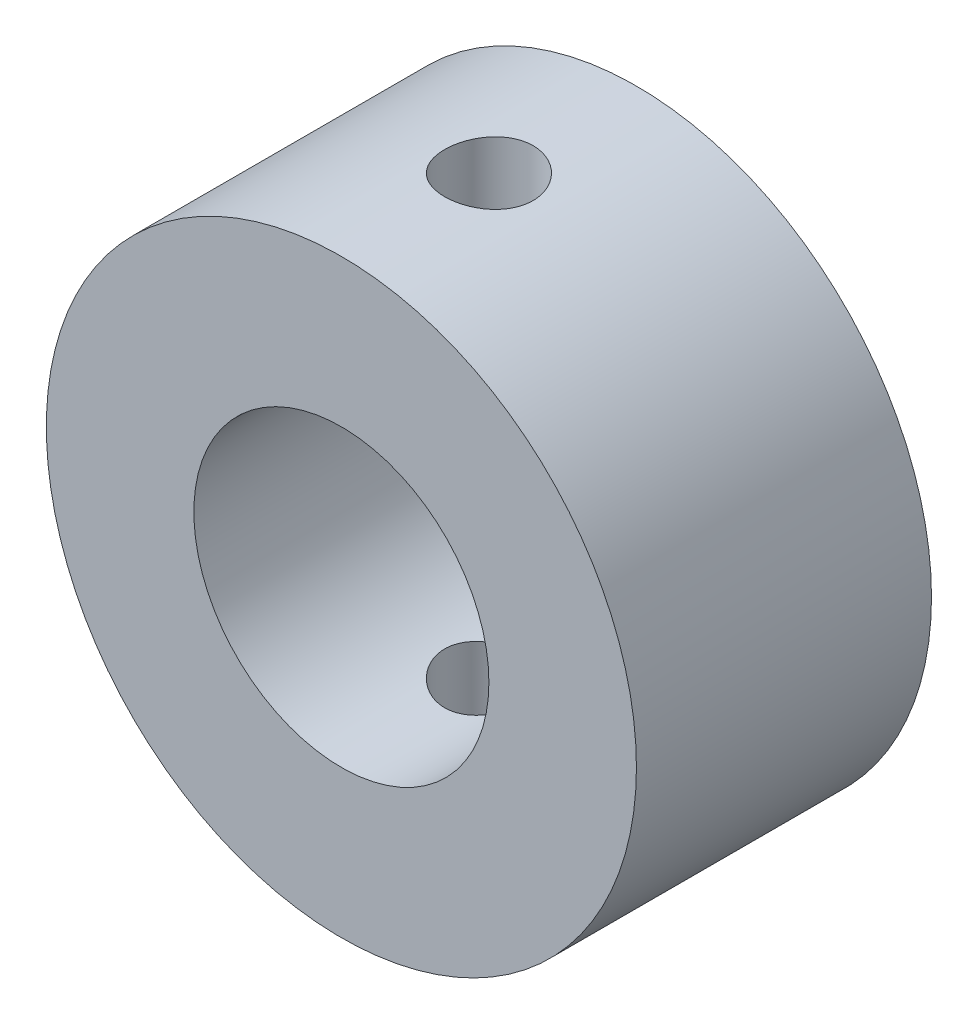
ISO-10303-21;
HEADER;
FILE_DESCRIPTION(('STEP AP214'),'2;1');
FILE_NAME('part.step','',(''),(''),'','','');
FILE_SCHEMA(('AUTOMOTIVE_DESIGN { 1 0 10303 214 1 1 1 1 }'));
ENDSEC;
DATA;
#1=APPLICATION_CONTEXT('core data for automotive mechanical design processes');
#2=APPLICATION_PROTOCOL_DEFINITION('international standard','automotive_design',2000,#1);
#3=PRODUCT_CONTEXT('',#1,'mechanical');
#4=PRODUCT('Part','Part','',(#3));
#5=PRODUCT_RELATED_PRODUCT_CATEGORY('part','',(#4));
#6=PRODUCT_DEFINITION_FORMATION('','',#4);
#7=PRODUCT_DEFINITION_CONTEXT('part definition',#1,'design');
#8=PRODUCT_DEFINITION('design','',#6,#7);
#9=PRODUCT_DEFINITION_SHAPE('','',#8);
#10=(LENGTH_UNIT() NAMED_UNIT(*) SI_UNIT(.MILLI.,.METRE.));
#11=(NAMED_UNIT(*) PLANE_ANGLE_UNIT() SI_UNIT($,.RADIAN.));
#12=(NAMED_UNIT(*) SI_UNIT($,.STERADIAN.) SOLID_ANGLE_UNIT());
#13=UNCERTAINTY_MEASURE_WITH_UNIT(LENGTH_MEASURE(1.E-05),#10,'distance_accuracy_value','');
#14=(GEOMETRIC_REPRESENTATION_CONTEXT(3) GLOBAL_UNCERTAINTY_ASSIGNED_CONTEXT((#13)) GLOBAL_UNIT_ASSIGNED_CONTEXT((#10,
#11,#12)) REPRESENTATION_CONTEXT('',''));
#15=CARTESIAN_POINT('',(0.,0.,0.));
#16=DIRECTION('',(0.,0.,1.));
#17=DIRECTION('',(1.,0.,0.));
#18=AXIS2_PLACEMENT_3D('',#15,#16,#17);
#19=CARTESIAN_POINT('',(0.,0.,20.));
#20=DIRECTION('',(0.,0.,1.));
#21=DIRECTION('',(1.,0.,0.));
#22=AXIS2_PLACEMENT_3D('',#19,#20,#21);
#23=PLANE('',#22);
#24=CARTESIAN_POINT('',(0.,0.,20.));
#25=DIRECTION('',(0.,0.,1.));
#26=DIRECTION('',(1.,0.,0.));
#27=AXIS2_PLACEMENT_3D('',#24,#25,#26);
#28=CIRCLE('',#27,20.);
#29=CARTESIAN_POINT('',(20.,0.,20.));
#30=VERTEX_POINT('',#29);
#31=EDGE_CURVE('E10',#30,#30,#28,.T.);
#32=ORIENTED_EDGE('',*,*,#31,.T.);
#33=EDGE_LOOP('',(#32));
#34=FACE_BOUND('',#33,.T.);
#35=CARTESIAN_POINT('',(0.,0.,20.));
#36=DIRECTION('',(0.,0.,1.));
#37=DIRECTION('',(1.,0.,0.));
#38=AXIS2_PLACEMENT_3D('',#35,#36,#37);
#39=CIRCLE('',#38,10.);
#40=CARTESIAN_POINT('',(10.,0.,20.));
#41=VERTEX_POINT('',#40);
#42=EDGE_CURVE('E49',#41,#41,#39,.T.);
#43=ORIENTED_EDGE('',*,*,#42,.F.);
#44=EDGE_LOOP('',(#43));
#45=FACE_BOUND('',#44,.T.);
#46=ADVANCED_FACE('F31',(#34,#45),#23,.T.);
#47=CARTESIAN_POINT('',(0.,0.,0.));
#48=DIRECTION('',(0.,0.,1.));
#49=DIRECTION('',(1.,0.,0.));
#50=AXIS2_PLACEMENT_3D('',#47,#48,#49);
#51=PLANE('',#50);
#52=CARTESIAN_POINT('',(0.,0.,0.));
#53=DIRECTION('',(0.,0.,1.));
#54=DIRECTION('',(1.,0.,0.));
#55=AXIS2_PLACEMENT_3D('',#52,#53,#54);
#56=CIRCLE('',#55,20.);
#57=CARTESIAN_POINT('',(20.,0.,0.));
#58=VERTEX_POINT('',#57);
#59=EDGE_CURVE('E44',#58,#58,#56,.T.);
#60=ORIENTED_EDGE('',*,*,#59,.F.);
#61=EDGE_LOOP('',(#60));
#62=FACE_BOUND('',#61,.T.);
#63=CARTESIAN_POINT('',(0.,0.,0.));
#64=DIRECTION('',(0.,0.,1.));
#65=DIRECTION('',(1.,0.,0.));
#66=AXIS2_PLACEMENT_3D('',#63,#64,#65);
#67=CIRCLE('',#66,10.);
#68=CARTESIAN_POINT('',(10.,0.,0.));
#69=VERTEX_POINT('',#68);
#70=EDGE_CURVE('E52',#69,#69,#67,.T.);
#71=ORIENTED_EDGE('',*,*,#70,.T.);
#72=EDGE_LOOP('',(#71));
#73=FACE_BOUND('',#72,.T.);
#74=ADVANCED_FACE('F85',(#62,#73),#51,.F.);
#75=CARTESIAN_POINT('',(0.,0.,20.));
#76=DIRECTION('',(0.,0.,-1.));
#77=DIRECTION('',(-1.,0.,0.));
#78=AXIS2_PLACEMENT_3D('',#75,#76,#77);
#79=CYLINDRICAL_SURFACE('',#78,20.);
#80=CARTESIAN_POINT('',(0.,-20.,13.));
#81=CARTESIAN_POINT('',(0.167503088963284,-19.9999973154259,12.9999930923695));
#82=CARTESIAN_POINT('',(0.335103370164263,-19.9978736507408,12.9859239983187));
#83=CARTESIAN_POINT('',(0.665619255989826,-19.9896063194637,12.9300336000345));
#84=CARTESIAN_POINT('',(0.828530137948458,-19.9834587387695,12.8881852741102));
#85=CARTESIAN_POINT('',(1.14483617244372,-19.9678344243905,12.7780149900648));
#86=CARTESIAN_POINT('',(1.2982384156536,-19.9583602074184,12.7097130409881));
#87=CARTESIAN_POINT('',(1.59138085727051,-19.9371295182345,12.5486232411663));
#88=CARTESIAN_POINT('',(1.73112294945038,-19.9253733630555,12.4558387911653));
#89=CARTESIAN_POINT('',(1.99409343912425,-19.900783419829,12.2476454701203));
#90=CARTESIAN_POINT('',(2.117199664451,-19.8879426778066,12.1320830875836));
#91=CARTESIAN_POINT('',(2.34234981337897,-19.8626852226648,11.8819446222123));
#92=CARTESIAN_POINT('',(2.44439252545871,-19.8502685339701,11.747367446443));
#93=CARTESIAN_POINT('',(2.62499458999886,-19.8271975491745,11.462198712955));
#94=CARTESIAN_POINT('',(2.7034357407441,-19.8165522395006,11.3115315060373));
#95=CARTESIAN_POINT('',(2.83385264342112,-19.7983242261254,10.9989743587091));
#96=CARTESIAN_POINT('',(2.88582983778326,-19.790741355509,10.8370850305122));
#97=CARTESIAN_POINT('',(2.96146397597822,-19.7795651243735,10.5079639162566));
#98=CARTESIAN_POINT('',(2.98533007281035,-19.775942314825,10.340781213184));
#99=CARTESIAN_POINT('',(3.00471248067865,-19.7730069794116,10.0047476680254));
#100=CARTESIAN_POINT('',(3.00023041947592,-19.7736942060629,9.83589692227501));
#101=CARTESIAN_POINT('',(2.96321466501575,-19.7792743670482,9.50279783961172));
#102=CARTESIAN_POINT('',(2.93091391855501,-19.784132375231,9.3385229470304));
#103=CARTESIAN_POINT('',(2.83954234807468,-19.7974521625273,9.01775126225694));
#104=CARTESIAN_POINT('',(2.78047076675624,-19.8059140435876,8.86125469023851));
#105=CARTESIAN_POINT('',(2.63699207059473,-19.8255267109096,8.55977325743428));
#106=CARTESIAN_POINT('',(2.55248628566395,-19.8366879353305,8.41483606181522));
#107=CARTESIAN_POINT('',(2.36060826257909,-19.860434151491,8.14111080843613));
#108=CARTESIAN_POINT('',(2.25323452364956,-19.87301923665,8.01232381146126));
#109=CARTESIAN_POINT('',(2.01738986156496,-19.8983494611242,7.77320467852057));
#110=CARTESIAN_POINT('',(1.888718659284,-19.9110949422563,7.66307001942732));
#111=CARTESIAN_POINT('',(1.61461417978837,-19.9351929529692,7.46592813098548));
#112=CARTESIAN_POINT('',(1.46918082917634,-19.9465454764502,7.37892100291221));
#113=CARTESIAN_POINT('',(1.16550919642737,-19.9665903117079,7.23049382700091));
#114=CARTESIAN_POINT('',(1.00726335567356,-19.9752810385086,7.16908901631941));
#115=CARTESIAN_POINT('',(0.682546364974119,-19.9890098111414,7.07378122062925));
#116=CARTESIAN_POINT('',(0.5160757719052,-19.9940481039093,7.03987637636885));
#117=CARTESIAN_POINT('',(0.181339135287292,-19.9998716226774,7.00079354036661));
#118=CARTESIAN_POINT('',(0.0131054637409409,-20.0006970418078,6.99534405724135));
#119=CARTESIAN_POINT('',(-0.321873355324565,-19.9981112203045,7.01260601062205));
#120=CARTESIAN_POINT('',(-0.488618548763754,-19.9947001108274,7.0353165753362));
#121=CARTESIAN_POINT('',(-0.815064774862816,-19.9840493723067,7.10802820035508));
#122=CARTESIAN_POINT('',(-0.974795926159675,-19.9768283041597,7.15789699206169));
#123=CARTESIAN_POINT('',(-1.283629917286,-19.9593647131674,7.28336999492351));
#124=CARTESIAN_POINT('',(-1.4327322575902,-19.9491220484313,7.35897541466726));
#125=CARTESIAN_POINT('',(-1.71726995858384,-19.9266536493737,7.53441244912772));
#126=CARTESIAN_POINT('',(-1.85259801978313,-19.9144140325349,7.63441628002554));
#127=CARTESIAN_POINT('',(-2.10464734635541,-19.8893572602433,7.85557162325749));
#128=CARTESIAN_POINT('',(-2.22136752958681,-19.8765400712573,7.9767243646493));
#129=CARTESIAN_POINT('',(-2.43387569914391,-19.8516452860899,8.23794706635298));
#130=CARTESIAN_POINT('',(-2.52948169494842,-19.8395747203518,8.37816585038954));
#131=CARTESIAN_POINT('',(-2.69578258541168,-19.8176643820981,8.67283208102354));
#132=CARTESIAN_POINT('',(-2.76647815312872,-19.8078245493126,8.82727914304293));
#133=CARTESIAN_POINT('',(-2.88066934647887,-19.7915406601729,9.14547506724626));
#134=CARTESIAN_POINT('',(-2.92426074283271,-19.7850846601288,9.30918892194249));
#135=CARTESIAN_POINT('',(-2.98331099003173,-19.776267645956,9.64171803087022));
#136=CARTESIAN_POINT('',(-2.99877178366133,-19.7739063490354,9.81053293198935));
#137=CARTESIAN_POINT('',(-3.0010757333888,-19.7735566522168,10.1466581266316));
#138=CARTESIAN_POINT('',(-2.98820504334625,-19.77552452667,10.3139664835138));
#139=CARTESIAN_POINT('',(-2.93482459088757,-19.7835164122235,10.644010526647));
#140=CARTESIAN_POINT('',(-2.89431487277254,-19.7895404168224,10.8067462202268));
#141=CARTESIAN_POINT('',(-2.7869074703733,-19.8049505222459,11.1229461644686));
#142=CARTESIAN_POINT('',(-2.72002978648628,-19.8143340743215,11.2764173408669));
#143=CARTESIAN_POINT('',(-2.56181335284618,-19.835409091154,11.5700072676048));
#144=CARTESIAN_POINT('',(-2.47047377483004,-19.8471006340545,11.7101255656073));
#145=CARTESIAN_POINT('',(-2.26488675318328,-19.8716148672988,11.9744861159503));
#146=CARTESIAN_POINT('',(-2.15042738079611,-19.8844473576393,12.0985626664941));
#147=CARTESIAN_POINT('',(-1.90229768216567,-19.9097157765327,12.3258491095756));
#148=CARTESIAN_POINT('',(-1.76862289670188,-19.9221516122152,12.4290541451523));
#149=CARTESIAN_POINT('',(-1.48499141508744,-19.9453037158104,12.6121753532147));
#150=CARTESIAN_POINT('',(-1.33494915352952,-19.9560101425764,12.6919602184295));
#151=CARTESIAN_POINT('',(-1.02350374049744,-19.9744005760592,12.8250770335161));
#152=CARTESIAN_POINT('',(-0.862112554193409,-19.9820877113151,12.8784363801074));
#153=CARTESIAN_POINT('',(-0.583331455778659,-19.9918187852301,12.9450826854202));
#154=CARTESIAN_POINT('',(-0.467662266990558,-19.9948709835911,12.9656452030776));
#155=CARTESIAN_POINT('',(-0.234677943200251,-19.9989625189579,12.9931061954253));
#156=CARTESIAN_POINT('',(-0.117362828668835,-20.0000018809755,13.0000048399051));
#157=CARTESIAN_POINT('',(0.,-20.,13.));
#158=B_SPLINE_CURVE_WITH_KNOTS('',3,(#80,#81,#82,#83,#84,#85,#86,#87,#88,#89,#90,#91,#92,#93,
#94,#95,#96,#97,#98,#99,#100,#101,#102,#103,#104,#105,#106,#107,#108,#109,#110,#111,#112,#113,
#114,#115,#116,#117,#118,#119,#120,#121,#122,#123,#124,#125,#126,#127,#128,#129,#130,#131,#132,
#133,#134,#135,#136,#137,#138,#139,#140,#141,#142,#143,#144,#145,#146,#147,#148,#149,#150,#151,
#152,#153,#154,#155,#156,#157),.UNSPECIFIED.,.T.,.F.,(4,2,2,2,2,2,2,2,2,2,2,2,2,2,2,2,2,2,2,2,2,
2,2,2,2,2,2,2,2,2,2,2,2,2,2,2,2,2,4),(0.,0.502080410063326,1.0046499258583,1.50684004716647,
2.0089604483952,2.51458832273687,3.0202452714516,3.5283940479075,4.03651512451012,
4.54083129211848,5.04511850197965,5.54522354391492,6.04534273380722,6.54742766952318,
7.04954556617068,7.55668582510817,8.06382830477336,8.57127217969749,9.07868174386802,
9.5812411708851,10.0837850398231,10.583902979319,11.0840444075255,11.5878237607381,
12.0916324005726,12.5996273316934,13.1076085361766,13.6137844691434,14.1199254427435,
14.6209777652213,15.1220292845913,15.6227014796829,16.1233906293376,16.6288965993144,
17.1345200693747,17.6429264676947,18.1508046652288,18.5025970395762,18.8543850424658),.UNSPECIFIED.);
#159=CARTESIAN_POINT('',(0.,-20.,13.));
#160=VERTEX_POINT('',#159);
#161=EDGE_CURVE('E75',#160,#160,#158,.T.);
#162=ORIENTED_EDGE('',*,*,#161,.T.);
#163=EDGE_LOOP('',(#162));
#164=FACE_BOUND('',#163,.T.);
#165=CARTESIAN_POINT('',(0.,20.,13.));
#166=CARTESIAN_POINT('',(-0.167503088963284,19.9999973154259,12.9999930923695));
#167=CARTESIAN_POINT('',(-0.335103370164263,19.9978736507408,12.9859239983187));
#168=CARTESIAN_POINT('',(-0.665619255989826,19.9896063194637,12.9300336000345));
#169=CARTESIAN_POINT('',(-0.828530137948458,19.9834587387695,12.8881852741102));
#170=CARTESIAN_POINT('',(-1.14483617244372,19.9678344243905,12.7780149900648));
#171=CARTESIAN_POINT('',(-1.2982384156536,19.9583602074184,12.7097130409881));
#172=CARTESIAN_POINT('',(-1.59138085727051,19.9371295182345,12.5486232411663));
#173=CARTESIAN_POINT('',(-1.73112294945038,19.9253733630555,12.4558387911653));
#174=CARTESIAN_POINT('',(-1.99409343912425,19.900783419829,12.2476454701203));
#175=CARTESIAN_POINT('',(-2.117199664451,19.8879426778066,12.1320830875836));
#176=CARTESIAN_POINT('',(-2.34234981337897,19.8626852226648,11.8819446222123));
#177=CARTESIAN_POINT('',(-2.44439252545871,19.8502685339701,11.747367446443));
#178=CARTESIAN_POINT('',(-2.62499458999886,19.8271975491745,11.462198712955));
#179=CARTESIAN_POINT('',(-2.7034357407441,19.8165522395006,11.3115315060373));
#180=CARTESIAN_POINT('',(-2.83385264342112,19.7983242261254,10.9989743587091));
#181=CARTESIAN_POINT('',(-2.88582983778326,19.790741355509,10.8370850305122));
#182=CARTESIAN_POINT('',(-2.96146397597822,19.7795651243735,10.5079639162566));
#183=CARTESIAN_POINT('',(-2.98533007281035,19.775942314825,10.340781213184));
#184=CARTESIAN_POINT('',(-3.00471248067865,19.7730069794116,10.0047476680254));
#185=CARTESIAN_POINT('',(-3.00023041947592,19.7736942060629,9.83589692227501));
#186=CARTESIAN_POINT('',(-2.96321466501575,19.7792743670482,9.50279783961172));
#187=CARTESIAN_POINT('',(-2.93091391855501,19.784132375231,9.3385229470304));
#188=CARTESIAN_POINT('',(-2.83954234807468,19.7974521625273,9.01775126225694));
#189=CARTESIAN_POINT('',(-2.78047076675624,19.8059140435876,8.86125469023851));
#190=CARTESIAN_POINT('',(-2.63699207059473,19.8255267109096,8.55977325743428));
#191=CARTESIAN_POINT('',(-2.55248628566395,19.8366879353305,8.41483606181522));
#192=CARTESIAN_POINT('',(-2.36060826257909,19.860434151491,8.14111080843613));
#193=CARTESIAN_POINT('',(-2.25323452364956,19.87301923665,8.01232381146126));
#194=CARTESIAN_POINT('',(-2.01738986156496,19.8983494611242,7.77320467852057));
#195=CARTESIAN_POINT('',(-1.888718659284,19.9110949422563,7.66307001942732));
#196=CARTESIAN_POINT('',(-1.61461417978837,19.9351929529692,7.46592813098548));
#197=CARTESIAN_POINT('',(-1.46918082917634,19.9465454764502,7.37892100291221));
#198=CARTESIAN_POINT('',(-1.16550919642737,19.9665903117079,7.23049382700091));
#199=CARTESIAN_POINT('',(-1.00726335567356,19.9752810385086,7.16908901631941));
#200=CARTESIAN_POINT('',(-0.682546364974119,19.9890098111414,7.07378122062925));
#201=CARTESIAN_POINT('',(-0.5160757719052,19.9940481039093,7.03987637636885));
#202=CARTESIAN_POINT('',(-0.181339135287292,19.9998716226774,7.00079354036661));
#203=CARTESIAN_POINT('',(-0.0131054637409409,20.0006970418078,6.99534405724135));
#204=CARTESIAN_POINT('',(0.321873355324565,19.9981112203045,7.01260601062205));
#205=CARTESIAN_POINT('',(0.488618548763754,19.9947001108274,7.0353165753362));
#206=CARTESIAN_POINT('',(0.815064774862816,19.9840493723067,7.10802820035508));
#207=CARTESIAN_POINT('',(0.974795926159675,19.9768283041597,7.15789699206169));
#208=CARTESIAN_POINT('',(1.283629917286,19.9593647131674,7.28336999492351));
#209=CARTESIAN_POINT('',(1.4327322575902,19.9491220484313,7.35897541466726));
#210=CARTESIAN_POINT('',(1.71726995858384,19.9266536493737,7.53441244912772));
#211=CARTESIAN_POINT('',(1.85259801978313,19.9144140325349,7.63441628002554));
#212=CARTESIAN_POINT('',(2.10464734635541,19.8893572602433,7.85557162325749));
#213=CARTESIAN_POINT('',(2.22136752958681,19.8765400712573,7.9767243646493));
#214=CARTESIAN_POINT('',(2.43387569914391,19.8516452860899,8.23794706635298));
#215=CARTESIAN_POINT('',(2.52948169494842,19.8395747203518,8.37816585038954));
#216=CARTESIAN_POINT('',(2.69578258541168,19.8176643820981,8.67283208102354));
#217=CARTESIAN_POINT('',(2.76647815312872,19.8078245493126,8.82727914304293));
#218=CARTESIAN_POINT('',(2.88066934647887,19.7915406601729,9.14547506724626));
#219=CARTESIAN_POINT('',(2.92426074283271,19.7850846601288,9.30918892194249));
#220=CARTESIAN_POINT('',(2.98331099003173,19.776267645956,9.64171803087022));
#221=CARTESIAN_POINT('',(2.99877178366133,19.7739063490354,9.81053293198935));
#222=CARTESIAN_POINT('',(3.0010757333888,19.7735566522168,10.1466581266316));
#223=CARTESIAN_POINT('',(2.98820504334625,19.77552452667,10.3139664835138));
#224=CARTESIAN_POINT('',(2.93482459088757,19.7835164122235,10.644010526647));
#225=CARTESIAN_POINT('',(2.89431487277254,19.7895404168224,10.8067462202268));
#226=CARTESIAN_POINT('',(2.7869074703733,19.8049505222459,11.1229461644686));
#227=CARTESIAN_POINT('',(2.72002978648628,19.8143340743215,11.2764173408669));
#228=CARTESIAN_POINT('',(2.56181335284618,19.835409091154,11.5700072676048));
#229=CARTESIAN_POINT('',(2.47047377483004,19.8471006340545,11.7101255656073));
#230=CARTESIAN_POINT('',(2.26488675318328,19.8716148672988,11.9744861159503));
#231=CARTESIAN_POINT('',(2.15042738079611,19.8844473576393,12.0985626664941));
#232=CARTESIAN_POINT('',(1.90229768216567,19.9097157765327,12.3258491095756));
#233=CARTESIAN_POINT('',(1.76862289670188,19.9221516122152,12.4290541451523));
#234=CARTESIAN_POINT('',(1.48499141508744,19.9453037158104,12.6121753532147));
#235=CARTESIAN_POINT('',(1.33494915352952,19.9560101425764,12.6919602184295));
#236=CARTESIAN_POINT('',(1.02350374049744,19.9744005760592,12.8250770335161));
#237=CARTESIAN_POINT('',(0.862112554193409,19.9820877113151,12.8784363801074));
#238=CARTESIAN_POINT('',(0.583331455778659,19.9918187852301,12.9450826854202));
#239=CARTESIAN_POINT('',(0.467662266990558,19.9948709835911,12.9656452030776));
#240=CARTESIAN_POINT('',(0.234677943200251,19.9989625189579,12.9931061954253));
#241=CARTESIAN_POINT('',(0.117362828668835,20.0000018809755,13.0000048399051));
#242=CARTESIAN_POINT('',(0.,20.,13.));
#243=B_SPLINE_CURVE_WITH_KNOTS('',3,(#165,#166,#167,#168,#169,#170,#171,#172,#173,#174,#175,
#176,#177,#178,#179,#180,#181,#182,#183,#184,#185,#186,#187,#188,#189,#190,#191,#192,#193,#194,
#195,#196,#197,#198,#199,#200,#201,#202,#203,#204,#205,#206,#207,#208,#209,#210,#211,#212,#213,
#214,#215,#216,#217,#218,#219,#220,#221,#222,#223,#224,#225,#226,#227,#228,#229,#230,#231,#232,
#233,#234,#235,#236,#237,#238,#239,#240,#241,#242),.UNSPECIFIED.,.T.,.F.,(4,2,2,2,2,2,2,2,2,2,2,
2,2,2,2,2,2,2,2,2,2,2,2,2,2,2,2,2,2,2,2,2,2,2,2,2,2,2,4),(0.,0.502080410063326,1.0046499258583,
1.50684004716647,2.0089604483952,2.51458832273687,3.0202452714516,3.5283940479075,
4.03651512451012,4.54083129211848,5.04511850197965,5.54522354391492,6.04534273380722,
6.54742766952318,7.04954556617068,7.55668582510817,8.06382830477336,8.57127217969749,
9.07868174386802,9.5812411708851,10.0837850398231,10.583902979319,11.0840444075255,
11.5878237607381,12.0916324005726,12.5996273316934,13.1076085361766,13.6137844691434,
14.1199254427435,14.6209777652213,15.1220292845913,15.6227014796829,16.1233906293376,
16.6288965993144,17.1345200693747,17.6429264676947,18.1508046652288,18.5025970395762,
18.8543850424658),.UNSPECIFIED.);
#244=CARTESIAN_POINT('',(0.,20.,13.));
#245=VERTEX_POINT('',#244);
#246=EDGE_CURVE('E71',#245,#245,#243,.T.);
#247=ORIENTED_EDGE('',*,*,#246,.T.);
#248=EDGE_LOOP('',(#247));
#249=FACE_BOUND('',#248,.T.);
#250=ORIENTED_EDGE('',*,*,#31,.F.);
#251=EDGE_LOOP('',(#250));
#252=FACE_BOUND('',#251,.T.);
#253=ORIENTED_EDGE('',*,*,#59,.T.);
#254=EDGE_LOOP('',(#253));
#255=FACE_BOUND('',#254,.T.);
#256=ADVANCED_FACE('F33',(#164,#249,#252,#255),#79,.T.);
#257=CARTESIAN_POINT('',(0.,0.,20.));
#258=DIRECTION('',(0.,0.,-1.));
#259=DIRECTION('',(-1.,0.,0.));
#260=AXIS2_PLACEMENT_3D('',#257,#258,#259);
#261=CYLINDRICAL_SURFACE('',#260,10.);
#262=CARTESIAN_POINT('',(0.,-10.,13.));
#263=CARTESIAN_POINT('',(0.1645772255066,-9.999998585011,12.9999980050302));
#264=CARTESIAN_POINT('',(0.329174636703059,-9.99589831387907,12.9864122727521));
#265=CARTESIAN_POINT('',(0.653576250609761,-9.97994211187382,12.9325572915558));
#266=CARTESIAN_POINT('',(0.81337900882284,-9.96808386779384,12.8922800839533));
#267=CARTESIAN_POINT('',(1.12346541550905,-9.93791105003673,12.7865079661795));
#268=CARTESIAN_POINT('',(1.27376272879075,-9.91960600500851,12.7210502607621));
#269=CARTESIAN_POINT('',(1.56124836210626,-9.87844218475291,12.5669278138883));
#270=CARTESIAN_POINT('',(1.69843493493934,-9.85558280384133,12.4782599852092));
#271=CARTESIAN_POINT('',(1.95974359436749,-9.80701474385548,12.2775519850547));
#272=CARTESIAN_POINT('',(2.08343614248868,-9.78124767314073,12.1649667482282));
#273=CARTESIAN_POINT('',(2.31049841846647,-9.73011668420884,11.9207815401796));
#274=CARTESIAN_POINT('',(2.41386472654882,-9.70475283449003,11.7891783757501));
#275=CARTESIAN_POINT('',(2.59960075447415,-9.65668227987544,11.5070584939248));
#276=CARTESIAN_POINT('',(2.68144618044427,-9.6340481332775,11.3561830780185));
#277=CARTESIAN_POINT('',(2.81842789549521,-9.59487240788062,11.0420214915394));
#278=CARTESIAN_POINT('',(2.87357059839947,-9.57832936626621,10.878738312144));
#279=CARTESIAN_POINT('',(2.95403267365303,-9.55381741676868,10.5492194677391));
#280=CARTESIAN_POINT('',(2.98014392469355,-9.54562138649067,10.3831945122721));
#281=CARTESIAN_POINT('',(3.00427461229344,-9.53805579499534,10.0489336875665));
#282=CARTESIAN_POINT('',(3.00230085522157,-9.53868409521142,9.88069836388182));
#283=CARTESIAN_POINT('',(2.97093954399623,-9.54849488135555,9.55323218278303));
#284=CARTESIAN_POINT('',(2.9425441052537,-9.55736777198281,9.39389549927552));
#285=CARTESIAN_POINT('',(2.86074840854112,-9.58216712457248,9.08236042745308));
#286=CARTESIAN_POINT('',(2.80734568283282,-9.59809428264701,8.93016274525133));
#287=CARTESIAN_POINT('',(2.67632053307363,-9.63545466149946,8.63479930067852));
#288=CARTESIAN_POINT('',(2.59837633869285,-9.65696032231904,8.49178583208947));
#289=CARTESIAN_POINT('',(2.42070445177367,-9.70301974000129,8.22053595597962));
#290=CARTESIAN_POINT('',(2.32097148005177,-9.72757423493982,8.09230314117245));
#291=CARTESIAN_POINT('',(2.09762581531093,-9.77822022595875,7.84862761847596));
#292=CARTESIAN_POINT('',(1.97318981493394,-9.80433308620996,7.73394267194066));
#293=CARTESIAN_POINT('',(1.70652651862793,-9.85424488126517,7.5268920318715));
#294=CARTESIAN_POINT('',(1.56429810372178,-9.8780436703682,7.43452774317115));
#295=CARTESIAN_POINT('',(1.26471007668561,-9.92086320138941,7.27428015507054));
#296=CARTESIAN_POINT('',(1.1072554994959,-9.93985087336628,7.20656496750028));
#297=CARTESIAN_POINT('',(0.782490831207039,-9.97067043664444,7.09880081980074));
#298=CARTESIAN_POINT('',(0.615183503179163,-9.98250432373999,7.05874414293502));
#299=CARTESIAN_POINT('',(0.281904485336663,-9.99736729287077,7.00869564420121));
#300=CARTESIAN_POINT('',(0.116100195202374,-10.0006970083558,6.99767682839678));
#301=CARTESIAN_POINT('',(-0.214999211646766,-9.99905846483519,7.00313831142416));
#302=CARTESIAN_POINT('',(-0.380294393381562,-9.99409131355514,7.01961493930288));
#303=CARTESIAN_POINT('',(-0.701807210619393,-9.97661393974325,7.07876922222299));
#304=CARTESIAN_POINT('',(-0.858145545228338,-9.96427659598829,7.12084677516174));
#305=CARTESIAN_POINT('',(-1.16150927790904,-9.9334869568307,7.2292864655564));
#306=CARTESIAN_POINT('',(-1.30853355405117,-9.91503392642188,7.29565152207572));
#307=CARTESIAN_POINT('',(-1.5928743789221,-9.87339308702631,7.45250633096226));
#308=CARTESIAN_POINT('',(-1.72988765239934,-9.8501056165928,7.54351868189596));
#309=CARTESIAN_POINT('',(-1.9870466159603,-9.80146937528705,7.74644950810561));
#310=CARTESIAN_POINT('',(-2.10718806471188,-9.7761200886242,7.8583732237753));
#311=CARTESIAN_POINT('',(-2.33171489102052,-9.72506343738007,8.10477461673874));
#312=CARTESIAN_POINT('',(-2.43536962463001,-9.69937650065513,8.23992375154365));
#313=CARTESIAN_POINT('',(-2.61857990144313,-9.65153030477949,8.52625587802689));
#314=CARTESIAN_POINT('',(-2.69813607658965,-9.62937095313121,8.67743844911576));
#315=CARTESIAN_POINT('',(-2.83034694254316,-9.5913437922631,8.99106498251004));
#316=CARTESIAN_POINT('',(-2.88312693874022,-9.57544675673501,9.15345237307567));
#317=CARTESIAN_POINT('',(-2.96043461630306,-9.55183188739737,9.48537593786047));
#318=CARTESIAN_POINT('',(-2.98497197957849,-9.54411125069387,9.65490964156607));
#319=CARTESIAN_POINT('',(-3.0044396896993,-9.53799944941558,9.98872303677684));
#320=CARTESIAN_POINT('',(-3.00056110615887,-9.53923294700394,10.1529273020988));
#321=CARTESIAN_POINT('',(-2.9661501088861,-9.54998802392188,10.4782282068012));
#322=CARTESIAN_POINT('',(-2.93561876249408,-9.55950927135902,10.639324970361));
#323=CARTESIAN_POINT('',(-2.84953777608686,-9.58551527389243,10.9518907982633));
#324=CARTESIAN_POINT('',(-2.79430351014248,-9.60191209104934,11.1034545747174));
#325=CARTESIAN_POINT('',(-2.66063014242147,-9.63980557805265,11.3952848776414));
#326=CARTESIAN_POINT('',(-2.58218659925722,-9.6613032238508,11.5355492352831));
#327=CARTESIAN_POINT('',(-2.40097527610175,-9.70795352855338,11.8063262330525));
#328=CARTESIAN_POINT('',(-2.29742552185996,-9.7332108032858,11.9362975225204));
#329=CARTESIAN_POINT('',(-2.07034869259555,-9.78402640899066,12.1774049966162));
#330=CARTESIAN_POINT('',(-1.94681643426898,-9.80958481647543,12.2885362789356));
#331=CARTESIAN_POINT('',(-1.67893152436652,-9.85901873141573,12.4920468245899));
#332=CARTESIAN_POINT('',(-1.53407577158122,-9.88282319531421,12.5837828937109));
#333=CARTESIAN_POINT('',(-1.23028274796705,-9.92521360911553,12.7414703398081));
#334=CARTESIAN_POINT('',(-1.07135210599791,-9.94380199862114,12.807433776549));
#335=CARTESIAN_POINT('',(-0.761515425310562,-9.97204349938619,12.9057905513055));
#336=CARTESIAN_POINT('',(-0.611573923908467,-9.9824405476214,12.9410233457665));
#337=CARTESIAN_POINT('',(-0.307760390461557,-9.9964188898898,12.9881270504832));
#338=CARTESIAN_POINT('',(-0.153889019716278,-10.0000013230948,13.0000018654096));
#339=CARTESIAN_POINT('',(0.,-10.,13.));
#340=B_SPLINE_CURVE_WITH_KNOTS('',3,(#262,#263,#264,#265,#266,#267,#268,#269,#270,#271,#272,
#273,#274,#275,#276,#277,#278,#279,#280,#281,#282,#283,#284,#285,#286,#287,#288,#289,#290,#291,
#292,#293,#294,#295,#296,#297,#298,#299,#300,#301,#302,#303,#304,#305,#306,#307,#308,#309,#310,
#311,#312,#313,#314,#315,#316,#317,#318,#319,#320,#321,#322,#323,#324,#325,#326,#327,#328,#329,
#330,#331,#332,#333,#334,#335,#336,#337,#338,#339),.UNSPECIFIED.,.T.,.F.,(4,2,2,2,2,2,2,2,2,2,2,
2,2,2,2,2,2,2,2,2,2,2,2,2,2,2,2,2,2,2,2,2,2,2,2,2,2,2,4),(0.,0.493166407225221,
0.986479929691999,1.47906735260175,1.9717203288254,2.47711205896383,2.98258874577266,
3.49942962008218,4.01614629086447,4.51839378713198,5.02051956638179,5.50452033395352,
5.98856887316003,6.47924852894239,6.97004720317111,7.48134208096333,7.99266913062143,
8.50742093763377,9.02202907057615,9.5181761887709,10.0142570710065,10.4991349336465,
10.9840710918746,11.4802261140582,11.9765056400038,12.4908080064564,13.0050968850536,
13.516956299025,14.0286401892057,14.5190031093854,15.0093463933232,15.4936008081456,
15.9779479511534,16.4799385136898,16.9820594980413,17.4988599232246,18.0154182319959,
18.4766338387004,18.9377723390687),.UNSPECIFIED.);
#341=CARTESIAN_POINT('',(0.,-10.,13.));
#342=VERTEX_POINT('',#341);
#343=EDGE_CURVE('E36',#342,#342,#340,.T.);
#344=ORIENTED_EDGE('',*,*,#343,.F.);
#345=EDGE_LOOP('',(#344));
#346=FACE_BOUND('',#345,.T.);
#347=CARTESIAN_POINT('',(0.,10.,13.));
#348=CARTESIAN_POINT('',(-0.1645772255066,9.999998585011,12.9999980050302));
#349=CARTESIAN_POINT('',(-0.329174636703059,9.99589831387907,12.9864122727521));
#350=CARTESIAN_POINT('',(-0.653576250609761,9.97994211187382,12.9325572915558));
#351=CARTESIAN_POINT('',(-0.81337900882284,9.96808386779384,12.8922800839533));
#352=CARTESIAN_POINT('',(-1.12346541550905,9.93791105003673,12.7865079661795));
#353=CARTESIAN_POINT('',(-1.27376272879075,9.91960600500851,12.7210502607621));
#354=CARTESIAN_POINT('',(-1.56124836210626,9.87844218475291,12.5669278138883));
#355=CARTESIAN_POINT('',(-1.69843493493934,9.85558280384133,12.4782599852092));
#356=CARTESIAN_POINT('',(-1.95974359436749,9.80701474385548,12.2775519850547));
#357=CARTESIAN_POINT('',(-2.08343614248868,9.78124767314073,12.1649667482282));
#358=CARTESIAN_POINT('',(-2.31049841846647,9.73011668420884,11.9207815401796));
#359=CARTESIAN_POINT('',(-2.41386472654882,9.70475283449003,11.7891783757501));
#360=CARTESIAN_POINT('',(-2.59960075447415,9.65668227987544,11.5070584939248));
#361=CARTESIAN_POINT('',(-2.68144618044427,9.6340481332775,11.3561830780185));
#362=CARTESIAN_POINT('',(-2.81842789549521,9.59487240788062,11.0420214915394));
#363=CARTESIAN_POINT('',(-2.87357059839947,9.57832936626621,10.878738312144));
#364=CARTESIAN_POINT('',(-2.95403267365303,9.55381741676868,10.5492194677391));
#365=CARTESIAN_POINT('',(-2.98014392469355,9.54562138649067,10.3831945122721));
#366=CARTESIAN_POINT('',(-3.00427461229344,9.53805579499534,10.0489336875665));
#367=CARTESIAN_POINT('',(-3.00230085522157,9.53868409521142,9.88069836388182));
#368=CARTESIAN_POINT('',(-2.97093954399623,9.54849488135555,9.55323218278303));
#369=CARTESIAN_POINT('',(-2.9425441052537,9.55736777198281,9.39389549927552));
#370=CARTESIAN_POINT('',(-2.86074840854112,9.58216712457248,9.08236042745308));
#371=CARTESIAN_POINT('',(-2.80734568283282,9.59809428264701,8.93016274525133));
#372=CARTESIAN_POINT('',(-2.67632053307363,9.63545466149946,8.63479930067852));
#373=CARTESIAN_POINT('',(-2.59837633869285,9.65696032231904,8.49178583208947));
#374=CARTESIAN_POINT('',(-2.42070445177367,9.70301974000129,8.22053595597962));
#375=CARTESIAN_POINT('',(-2.32097148005177,9.72757423493982,8.09230314117245));
#376=CARTESIAN_POINT('',(-2.09762581531093,9.77822022595875,7.84862761847596));
#377=CARTESIAN_POINT('',(-1.97318981493394,9.80433308620996,7.73394267194066));
#378=CARTESIAN_POINT('',(-1.70652651862793,9.85424488126517,7.5268920318715));
#379=CARTESIAN_POINT('',(-1.56429810372178,9.8780436703682,7.43452774317115));
#380=CARTESIAN_POINT('',(-1.26471007668561,9.92086320138941,7.27428015507054));
#381=CARTESIAN_POINT('',(-1.1072554994959,9.93985087336628,7.20656496750028));
#382=CARTESIAN_POINT('',(-0.782490831207039,9.97067043664444,7.09880081980074));
#383=CARTESIAN_POINT('',(-0.615183503179163,9.98250432373999,7.05874414293502));
#384=CARTESIAN_POINT('',(-0.281904485336663,9.99736729287077,7.00869564420121));
#385=CARTESIAN_POINT('',(-0.116100195202374,10.0006970083558,6.99767682839678));
#386=CARTESIAN_POINT('',(0.214999211646766,9.99905846483519,7.00313831142416));
#387=CARTESIAN_POINT('',(0.380294393381562,9.99409131355514,7.01961493930288));
#388=CARTESIAN_POINT('',(0.701807210619393,9.97661393974325,7.07876922222299));
#389=CARTESIAN_POINT('',(0.858145545228338,9.96427659598829,7.12084677516174));
#390=CARTESIAN_POINT('',(1.16150927790904,9.9334869568307,7.2292864655564));
#391=CARTESIAN_POINT('',(1.30853355405117,9.91503392642188,7.29565152207572));
#392=CARTESIAN_POINT('',(1.5928743789221,9.87339308702631,7.45250633096226));
#393=CARTESIAN_POINT('',(1.72988765239934,9.8501056165928,7.54351868189596));
#394=CARTESIAN_POINT('',(1.9870466159603,9.80146937528705,7.74644950810561));
#395=CARTESIAN_POINT('',(2.10718806471188,9.7761200886242,7.8583732237753));
#396=CARTESIAN_POINT('',(2.33171489102052,9.72506343738007,8.10477461673874));
#397=CARTESIAN_POINT('',(2.43536962463001,9.69937650065513,8.23992375154365));
#398=CARTESIAN_POINT('',(2.61857990144313,9.65153030477949,8.52625587802689));
#399=CARTESIAN_POINT('',(2.69813607658965,9.62937095313121,8.67743844911576));
#400=CARTESIAN_POINT('',(2.83034694254316,9.5913437922631,8.99106498251004));
#401=CARTESIAN_POINT('',(2.88312693874022,9.57544675673501,9.15345237307567));
#402=CARTESIAN_POINT('',(2.96043461630306,9.55183188739737,9.48537593786047));
#403=CARTESIAN_POINT('',(2.98497197957849,9.54411125069387,9.65490964156607));
#404=CARTESIAN_POINT('',(3.0044396896993,9.53799944941558,9.98872303677684));
#405=CARTESIAN_POINT('',(3.00056110615887,9.53923294700394,10.1529273020988));
#406=CARTESIAN_POINT('',(2.9661501088861,9.54998802392188,10.4782282068012));
#407=CARTESIAN_POINT('',(2.93561876249408,9.55950927135902,10.639324970361));
#408=CARTESIAN_POINT('',(2.84953777608686,9.58551527389243,10.9518907982633));
#409=CARTESIAN_POINT('',(2.79430351014248,9.60191209104934,11.1034545747174));
#410=CARTESIAN_POINT('',(2.66063014242147,9.63980557805265,11.3952848776414));
#411=CARTESIAN_POINT('',(2.58218659925722,9.6613032238508,11.5355492352831));
#412=CARTESIAN_POINT('',(2.40097527610175,9.70795352855338,11.8063262330525));
#413=CARTESIAN_POINT('',(2.29742552185996,9.7332108032858,11.9362975225204));
#414=CARTESIAN_POINT('',(2.07034869259555,9.78402640899066,12.1774049966162));
#415=CARTESIAN_POINT('',(1.94681643426898,9.80958481647543,12.2885362789356));
#416=CARTESIAN_POINT('',(1.67893152436652,9.85901873141573,12.4920468245899));
#417=CARTESIAN_POINT('',(1.53407577158122,9.88282319531421,12.5837828937109));
#418=CARTESIAN_POINT('',(1.23028274796705,9.92521360911553,12.7414703398081));
#419=CARTESIAN_POINT('',(1.07135210599791,9.94380199862114,12.807433776549));
#420=CARTESIAN_POINT('',(0.761515425310562,9.97204349938619,12.9057905513055));
#421=CARTESIAN_POINT('',(0.611573923908467,9.9824405476214,12.9410233457665));
#422=CARTESIAN_POINT('',(0.307760390461557,9.9964188898898,12.9881270504832));
#423=CARTESIAN_POINT('',(0.153889019716278,10.0000013230948,13.0000018654096));
#424=CARTESIAN_POINT('',(0.,10.,13.));
#425=B_SPLINE_CURVE_WITH_KNOTS('',3,(#347,#348,#349,#350,#351,#352,#353,#354,#355,#356,#357,
#358,#359,#360,#361,#362,#363,#364,#365,#366,#367,#368,#369,#370,#371,#372,#373,#374,#375,#376,
#377,#378,#379,#380,#381,#382,#383,#384,#385,#386,#387,#388,#389,#390,#391,#392,#393,#394,#395,
#396,#397,#398,#399,#400,#401,#402,#403,#404,#405,#406,#407,#408,#409,#410,#411,#412,#413,#414,
#415,#416,#417,#418,#419,#420,#421,#422,#423,#424),.UNSPECIFIED.,.T.,.F.,(4,2,2,2,2,2,2,2,2,2,2,
2,2,2,2,2,2,2,2,2,2,2,2,2,2,2,2,2,2,2,2,2,2,2,2,2,2,2,4),(0.,0.493166407225221,
0.986479929691999,1.47906735260175,1.9717203288254,2.47711205896383,2.98258874577266,
3.49942962008218,4.01614629086447,4.51839378713198,5.02051956638179,5.50452033395352,
5.98856887316003,6.47924852894239,6.97004720317111,7.48134208096333,7.99266913062143,
8.50742093763377,9.02202907057615,9.5181761887709,10.0142570710065,10.4991349336465,
10.9840710918746,11.4802261140582,11.9765056400038,12.4908080064564,13.0050968850536,
13.516956299025,14.0286401892057,14.5190031093854,15.0093463933232,15.4936008081456,
15.9779479511534,16.4799385136898,16.9820594980413,17.4988599232246,18.0154182319959,
18.4766338387004,18.9377723390687),.UNSPECIFIED.);
#426=CARTESIAN_POINT('',(0.,10.,13.));
#427=VERTEX_POINT('',#426);
#428=EDGE_CURVE('E54',#427,#427,#425,.T.);
#429=ORIENTED_EDGE('',*,*,#428,.F.);
#430=EDGE_LOOP('',(#429));
#431=FACE_BOUND('',#430,.T.);
#432=ORIENTED_EDGE('',*,*,#42,.T.);
#433=EDGE_LOOP('',(#432));
#434=FACE_BOUND('',#433,.T.);
#435=ORIENTED_EDGE('',*,*,#70,.F.);
#436=EDGE_LOOP('',(#435));
#437=FACE_BOUND('',#436,.T.);
#438=ADVANCED_FACE('F58',(#346,#431,#434,#437),#261,.F.);
#439=CARTESIAN_POINT('',(0.,-28.,10.));
#440=DIRECTION('',(0.,1.,0.));
#441=DIRECTION('',(0.,0.,1.));
#442=AXIS2_PLACEMENT_3D('',#439,#440,#441);
#443=CYLINDRICAL_SURFACE('',#442,3.);
#444=ORIENTED_EDGE('',*,*,#428,.T.);
#445=EDGE_LOOP('',(#444));
#446=FACE_BOUND('',#445,.T.);
#447=ORIENTED_EDGE('',*,*,#246,.F.);
#448=EDGE_LOOP('',(#447));
#449=FACE_BOUND('',#448,.T.);
#450=ADVANCED_FACE('F64',(#446,#449),#443,.F.);
#451=ORIENTED_EDGE('',*,*,#343,.T.);
#452=EDGE_LOOP('',(#451));
#453=FACE_BOUND('',#452,.T.);
#454=ORIENTED_EDGE('',*,*,#161,.F.);
#455=EDGE_LOOP('',(#454));
#456=FACE_BOUND('',#455,.T.);
#457=ADVANCED_FACE('F61',(#453,#456),#443,.F.);
#458=CLOSED_SHELL('',(#46,#74,#256,#438,#450,#457));
#459=MANIFOLD_SOLID_BREP('B2',#458);
#460=ADVANCED_BREP_SHAPE_REPRESENTATION('',(#18,#459),#14);
#461=SHAPE_DEFINITION_REPRESENTATION(#9,#460);
ENDSEC;
END-ISO-10303-21;
